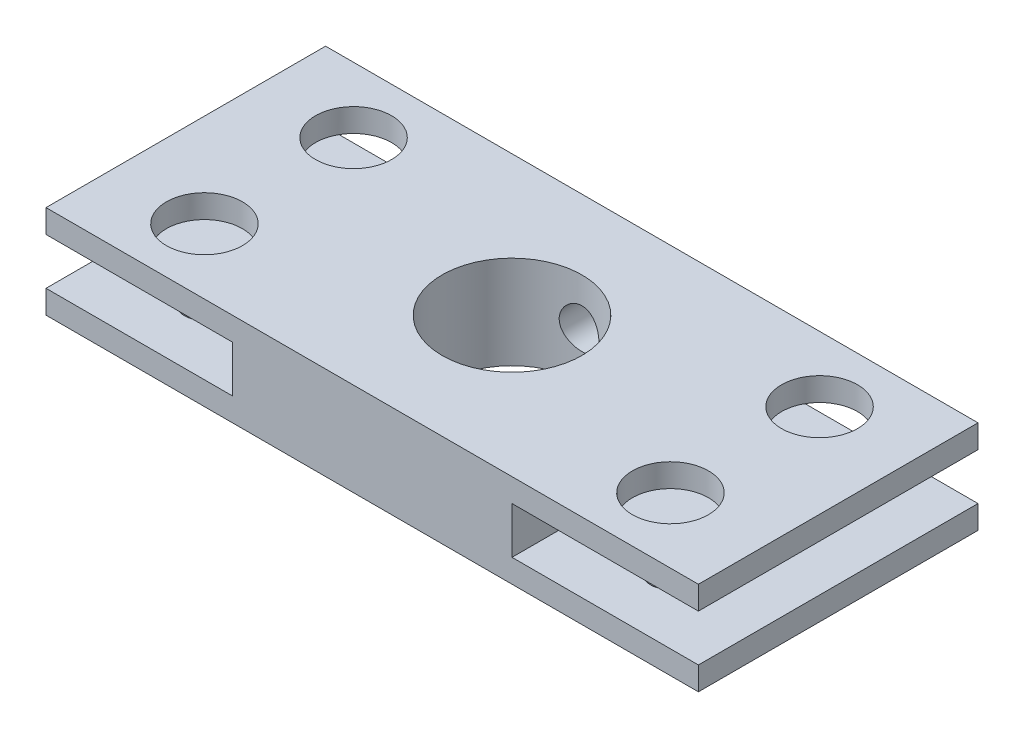
ISO-10303-21;
HEADER;
FILE_DESCRIPTION(('STEP AP214'),'2;1');
FILE_NAME('part.step','',(''),(''),'','','');
FILE_SCHEMA(('AUTOMOTIVE_DESIGN { 1 0 10303 214 1 1 1 1 }'));
ENDSEC;
DATA;
#1=APPLICATION_CONTEXT('core data for automotive mechanical design processes');
#2=APPLICATION_PROTOCOL_DEFINITION('international standard','automotive_design',2000,#1);
#3=PRODUCT_CONTEXT('',#1,'mechanical');
#4=PRODUCT('Part','Part','',(#3));
#5=PRODUCT_RELATED_PRODUCT_CATEGORY('part','',(#4));
#6=PRODUCT_DEFINITION_FORMATION('','',#4);
#7=PRODUCT_DEFINITION_CONTEXT('part definition',#1,'design');
#8=PRODUCT_DEFINITION('design','',#6,#7);
#9=PRODUCT_DEFINITION_SHAPE('','',#8);
#10=(LENGTH_UNIT() NAMED_UNIT(*) SI_UNIT(.MILLI.,.METRE.));
#11=(NAMED_UNIT(*) PLANE_ANGLE_UNIT() SI_UNIT($,.RADIAN.));
#12=(NAMED_UNIT(*) SI_UNIT($,.STERADIAN.) SOLID_ANGLE_UNIT());
#13=UNCERTAINTY_MEASURE_WITH_UNIT(LENGTH_MEASURE(1.E-05),#10,'distance_accuracy_value','');
#14=(GEOMETRIC_REPRESENTATION_CONTEXT(3) GLOBAL_UNCERTAINTY_ASSIGNED_CONTEXT((#13)) GLOBAL_UNIT_ASSIGNED_CONTEXT((#10,
#11,#12)) REPRESENTATION_CONTEXT('',''));
#15=CARTESIAN_POINT('',(0.,0.,0.));
#16=DIRECTION('',(0.,0.,1.));
#17=DIRECTION('',(1.,0.,0.));
#18=AXIS2_PLACEMENT_3D('',#15,#16,#17);
#19=CARTESIAN_POINT('',(0.,6.35,0.));
#20=DIRECTION('',(0.,-1.,0.));
#21=DIRECTION('',(0.,0.,-1.));
#22=AXIS2_PLACEMENT_3D('',#19,#20,#21);
#23=PLANE('',#22);
#24=CARTESIAN_POINT('',(15.875,6.35,5.08));
#25=DIRECTION('',(0.,1.,0.));
#26=DIRECTION('',(0.,0.,1.));
#27=AXIS2_PLACEMENT_3D('',#24,#25,#26);
#28=CIRCLE('',#27,2.59079999999999);
#29=CARTESIAN_POINT('',(15.875,6.35,7.67079999999999));
#30=VERTEX_POINT('',#29);
#31=EDGE_CURVE('E336',#30,#30,#28,.T.);
#32=ORIENTED_EDGE('',*,*,#31,.F.);
#33=EDGE_LOOP('',(#32));
#34=FACE_BOUND('',#33,.T.);
#35=DIRECTION('',(0.,0.,-1.));
#36=VECTOR('',#35,1.);
#37=CARTESIAN_POINT('',(22.225,6.35,9.525));
#38=LINE('',#37,#36);
#39=CARTESIAN_POINT('',(22.225,6.35,9.525));
#40=VERTEX_POINT('',#39);
#41=CARTESIAN_POINT('',(22.225,6.35,-9.525));
#42=VERTEX_POINT('',#41);
#43=EDGE_CURVE('E169',#40,#42,#38,.T.);
#44=ORIENTED_EDGE('',*,*,#43,.T.);
#45=DIRECTION('',(-1.,0.,0.));
#46=VECTOR('',#45,1.);
#47=CARTESIAN_POINT('',(-22.225,6.35,-9.525));
#48=LINE('',#47,#46);
#49=CARTESIAN_POINT('',(-22.225,6.35,-9.525));
#50=VERTEX_POINT('',#49);
#51=EDGE_CURVE('E181',#42,#50,#48,.T.);
#52=ORIENTED_EDGE('',*,*,#51,.T.);
#53=DIRECTION('',(0.,0.,1.));
#54=VECTOR('',#53,1.);
#55=CARTESIAN_POINT('',(-22.225,6.35,9.525));
#56=LINE('',#55,#54);
#57=CARTESIAN_POINT('',(-22.225,6.35,9.525));
#58=VERTEX_POINT('',#57);
#59=EDGE_CURVE('E179',#50,#58,#56,.T.);
#60=ORIENTED_EDGE('',*,*,#59,.T.);
#61=DIRECTION('',(1.,0.,0.));
#62=VECTOR('',#61,1.);
#63=CARTESIAN_POINT('',(-22.225,6.35,9.525));
#64=LINE('',#63,#62);
#65=EDGE_CURVE('E177',#58,#40,#64,.T.);
#66=ORIENTED_EDGE('',*,*,#65,.T.);
#67=EDGE_LOOP('',(#44,#52,#60,#66));
#68=FACE_BOUND('',#67,.T.);
#69=CARTESIAN_POINT('',(0.,6.35,0.));
#70=DIRECTION('',(0.,1.,0.));
#71=DIRECTION('',(0.,0.,1.));
#72=AXIS2_PLACEMENT_3D('',#69,#70,#71);
#73=CIRCLE('',#72,4.7625);
#74=CARTESIAN_POINT('',(0.,6.35,4.7625));
#75=VERTEX_POINT('',#74);
#76=EDGE_CURVE('E176',#75,#75,#73,.T.);
#77=ORIENTED_EDGE('',*,*,#76,.F.);
#78=EDGE_LOOP('',(#77));
#79=FACE_BOUND('',#78,.T.);
#80=CARTESIAN_POINT('',(15.875,6.35,-5.08));
#81=DIRECTION('',(0.,1.,0.));
#82=DIRECTION('',(0.,0.,1.));
#83=AXIS2_PLACEMENT_3D('',#80,#81,#82);
#84=CIRCLE('',#83,2.59079999999999);
#85=CARTESIAN_POINT('',(15.875,6.35,-2.48920000000001));
#86=VERTEX_POINT('',#85);
#87=EDGE_CURVE('E330',#86,#86,#84,.T.);
#88=ORIENTED_EDGE('',*,*,#87,.F.);
#89=EDGE_LOOP('',(#88));
#90=FACE_BOUND('',#89,.T.);
#91=CARTESIAN_POINT('',(-15.875,6.35,5.08));
#92=DIRECTION('',(0.,1.,0.));
#93=DIRECTION('',(0.,0.,1.));
#94=AXIS2_PLACEMENT_3D('',#91,#92,#93);
#95=CIRCLE('',#94,2.59079999999999);
#96=CARTESIAN_POINT('',(-15.875,6.35,7.67079999999999));
#97=VERTEX_POINT('',#96);
#98=EDGE_CURVE('E394',#97,#97,#95,.T.);
#99=ORIENTED_EDGE('',*,*,#98,.F.);
#100=EDGE_LOOP('',(#99));
#101=FACE_BOUND('',#100,.T.);
#102=CARTESIAN_POINT('',(-15.875,6.35,-5.08));
#103=DIRECTION('',(0.,1.,0.));
#104=DIRECTION('',(0.,0.,1.));
#105=AXIS2_PLACEMENT_3D('',#102,#103,#104);
#106=CIRCLE('',#105,2.59079999999999);
#107=CARTESIAN_POINT('',(-15.875,6.35,-2.48920000000001));
#108=VERTEX_POINT('',#107);
#109=EDGE_CURVE('E397',#108,#108,#106,.T.);
#110=ORIENTED_EDGE('',*,*,#109,.F.);
#111=EDGE_LOOP('',(#110));
#112=FACE_BOUND('',#111,.T.);
#113=ADVANCED_FACE('F43',(#34,#68,#79,#90,#101,#112),#23,.F.);
#114=CARTESIAN_POINT('',(-22.225,6.35,-9.525));
#115=DIRECTION('',(0.,0.,1.));
#116=DIRECTION('',(1.,0.,0.));
#117=AXIS2_PLACEMENT_3D('',#114,#115,#116);
#118=PLANE('',#117);
#119=CARTESIAN_POINT('',(0.,3.175,-9.525));
#120=DIRECTION('',(0.,0.,-1.));
#121=DIRECTION('',(-1.,0.,0.));
#122=AXIS2_PLACEMENT_3D('',#119,#120,#121);
#123=CIRCLE('',#122,1.35255);
#124=CARTESIAN_POINT('',(-1.35255,3.175,-9.525));
#125=VERTEX_POINT('',#124);
#126=EDGE_CURVE('E198',#125,#125,#123,.T.);
#127=ORIENTED_EDGE('',*,*,#126,.F.);
#128=EDGE_LOOP('',(#127));
#129=FACE_BOUND('',#128,.T.);
#130=DIRECTION('',(1.,0.,0.));
#131=VECTOR('',#130,1.);
#132=CARTESIAN_POINT('',(-9.52500000000001,4.7625,-9.525));
#133=LINE('',#132,#131);
#134=CARTESIAN_POINT('',(-22.225,4.7625,-9.525));
#135=VERTEX_POINT('',#134);
#136=CARTESIAN_POINT('',(-9.52500000000001,4.7625,-9.525));
#137=VERTEX_POINT('',#136);
#138=EDGE_CURVE('E149',#135,#137,#133,.T.);
#139=ORIENTED_EDGE('',*,*,#138,.F.);
#140=DIRECTION('',(0.,-1.,0.));
#141=VECTOR('',#140,1.);
#142=CARTESIAN_POINT('',(-22.225,6.35,-9.525));
#143=LINE('',#142,#141);
#144=EDGE_CURVE('E156',#50,#135,#143,.T.);
#145=ORIENTED_EDGE('',*,*,#144,.F.);
#146=ORIENTED_EDGE('',*,*,#51,.F.);
#147=DIRECTION('',(0.,-1.,0.));
#148=VECTOR('',#147,1.);
#149=CARTESIAN_POINT('',(22.225,6.35,-9.525));
#150=LINE('',#149,#148);
#151=CARTESIAN_POINT('',(22.225,4.7625,-9.525));
#152=VERTEX_POINT('',#151);
#153=EDGE_CURVE('E11',#42,#152,#150,.T.);
#154=ORIENTED_EDGE('',*,*,#153,.T.);
#155=DIRECTION('',(-1.,0.,0.));
#156=VECTOR('',#155,1.);
#157=CARTESIAN_POINT('',(9.52500000000001,4.7625,-9.525));
#158=LINE('',#157,#156);
#159=CARTESIAN_POINT('',(9.52500000000001,4.7625,-9.525));
#160=VERTEX_POINT('',#159);
#161=EDGE_CURVE('E343',#152,#160,#158,.T.);
#162=ORIENTED_EDGE('',*,*,#161,.T.);
#163=DIRECTION('',(0.,-1.,0.));
#164=VECTOR('',#163,1.);
#165=CARTESIAN_POINT('',(9.52500000000001,1.5875,-9.525));
#166=LINE('',#165,#164);
#167=CARTESIAN_POINT('',(9.52500000000001,1.5875,-9.525));
#168=VERTEX_POINT('',#167);
#169=EDGE_CURVE('E346',#160,#168,#166,.T.);
#170=ORIENTED_EDGE('',*,*,#169,.T.);
#171=DIRECTION('',(1.,0.,0.));
#172=VECTOR('',#171,1.);
#173=CARTESIAN_POINT('',(9.52500000000001,1.5875,-9.525));
#174=LINE('',#173,#172);
#175=CARTESIAN_POINT('',(22.225,1.5875,-9.525));
#176=VERTEX_POINT('',#175);
#177=EDGE_CURVE('E350',#168,#176,#174,.T.);
#178=ORIENTED_EDGE('',*,*,#177,.T.);
#179=CARTESIAN_POINT('',(22.225,0.,-9.525));
#180=VERTEX_POINT('',#179);
#181=EDGE_CURVE('E51',#176,#180,#150,.T.);
#182=ORIENTED_EDGE('',*,*,#181,.T.);
#183=DIRECTION('',(-1.,0.,0.));
#184=VECTOR('',#183,1.);
#185=CARTESIAN_POINT('',(-22.225,0.,-9.525));
#186=LINE('',#185,#184);
#187=CARTESIAN_POINT('',(-22.225,0.,-9.525));
#188=VERTEX_POINT('',#187);
#189=EDGE_CURVE('E154',#180,#188,#186,.T.);
#190=ORIENTED_EDGE('',*,*,#189,.T.);
#191=CARTESIAN_POINT('',(-22.225,1.5875,-9.525));
#192=VERTEX_POINT('',#191);
#193=EDGE_CURVE('E146',#192,#188,#143,.T.);
#194=ORIENTED_EDGE('',*,*,#193,.F.);
#195=DIRECTION('',(-1.,0.,0.));
#196=VECTOR('',#195,1.);
#197=CARTESIAN_POINT('',(-9.52500000000001,1.5875,-9.525));
#198=LINE('',#197,#196);
#199=CARTESIAN_POINT('',(-9.52500000000001,1.5875,-9.525));
#200=VERTEX_POINT('',#199);
#201=EDGE_CURVE('E133',#200,#192,#198,.T.);
#202=ORIENTED_EDGE('',*,*,#201,.F.);
#203=DIRECTION('',(0.,-1.,0.));
#204=VECTOR('',#203,1.);
#205=CARTESIAN_POINT('',(-9.52500000000001,1.5875,-9.525));
#206=LINE('',#205,#204);
#207=EDGE_CURVE('E139',#137,#200,#206,.T.);
#208=ORIENTED_EDGE('',*,*,#207,.F.);
#209=EDGE_LOOP('',(#139,#145,#146,#154,#162,#170,#178,#182,#190,#194,#202,#208));
#210=FACE_BOUND('',#209,.T.);
#211=ADVANCED_FACE('F152',(#129,#210),#118,.F.);
#212=CARTESIAN_POINT('',(-22.225,6.35,9.525));
#213=DIRECTION('',(1.,0.,0.));
#214=DIRECTION('',(0.,0.,-1.));
#215=AXIS2_PLACEMENT_3D('',#212,#213,#214);
#216=PLANE('',#215);
#217=DIRECTION('',(0.,0.,1.));
#218=VECTOR('',#217,1.);
#219=CARTESIAN_POINT('',(-22.225,4.7625,-9.525));
#220=LINE('',#219,#218);
#221=CARTESIAN_POINT('',(-22.225,4.7625,9.525));
#222=VERTEX_POINT('',#221);
#223=EDGE_CURVE('E293',#135,#222,#220,.T.);
#224=ORIENTED_EDGE('',*,*,#223,.T.);
#225=DIRECTION('',(0.,-1.,0.));
#226=VECTOR('',#225,1.);
#227=CARTESIAN_POINT('',(-22.225,6.35,9.525));
#228=LINE('',#227,#226);
#229=EDGE_CURVE('E157',#58,#222,#228,.T.);
#230=ORIENTED_EDGE('',*,*,#229,.F.);
#231=ORIENTED_EDGE('',*,*,#59,.F.);
#232=ORIENTED_EDGE('',*,*,#144,.T.);
#233=EDGE_LOOP('',(#224,#230,#231,#232));
#234=FACE_BOUND('',#233,.T.);
#235=ADVANCED_FACE('F274',(#234),#216,.F.);
#236=DIRECTION('',(0.,0.,1.));
#237=VECTOR('',#236,1.);
#238=CARTESIAN_POINT('',(-22.225,1.5875,-9.525));
#239=LINE('',#238,#237);
#240=CARTESIAN_POINT('',(-22.225,1.5875,9.525));
#241=VERTEX_POINT('',#240);
#242=EDGE_CURVE('E58',#192,#241,#239,.T.);
#243=ORIENTED_EDGE('',*,*,#242,.F.);
#244=ORIENTED_EDGE('',*,*,#193,.T.);
#245=DIRECTION('',(0.,0.,1.));
#246=VECTOR('',#245,1.);
#247=CARTESIAN_POINT('',(-22.225,0.,9.525));
#248=LINE('',#247,#246);
#249=CARTESIAN_POINT('',(-22.225,0.,9.525));
#250=VERTEX_POINT('',#249);
#251=EDGE_CURVE('E170',#188,#250,#248,.T.);
#252=ORIENTED_EDGE('',*,*,#251,.T.);
#253=EDGE_CURVE('E148',#241,#250,#228,.T.);
#254=ORIENTED_EDGE('',*,*,#253,.F.);
#255=EDGE_LOOP('',(#243,#244,#252,#254));
#256=FACE_BOUND('',#255,.T.);
#257=ADVANCED_FACE('F144',(#256),#216,.F.);
#258=CARTESIAN_POINT('',(-22.225,6.35,9.525));
#259=DIRECTION('',(0.,0.,-1.));
#260=DIRECTION('',(-1.,0.,0.));
#261=AXIS2_PLACEMENT_3D('',#258,#259,#260);
#262=PLANE('',#261);
#263=DIRECTION('',(1.,0.,0.));
#264=VECTOR('',#263,1.);
#265=CARTESIAN_POINT('',(-9.52500000000001,4.7625,9.525));
#266=LINE('',#265,#264);
#267=CARTESIAN_POINT('',(-9.52500000000001,4.7625,9.525));
#268=VERTEX_POINT('',#267);
#269=EDGE_CURVE('E140',#222,#268,#266,.T.);
#270=ORIENTED_EDGE('',*,*,#269,.T.);
#271=DIRECTION('',(0.,-1.,0.));
#272=VECTOR('',#271,1.);
#273=CARTESIAN_POINT('',(-9.52500000000001,1.5875,9.525));
#274=LINE('',#273,#272);
#275=CARTESIAN_POINT('',(-9.52500000000001,1.5875,9.525));
#276=VERTEX_POINT('',#275);
#277=EDGE_CURVE('E313',#268,#276,#274,.T.);
#278=ORIENTED_EDGE('',*,*,#277,.T.);
#279=DIRECTION('',(-1.,0.,0.));
#280=VECTOR('',#279,1.);
#281=CARTESIAN_POINT('',(-9.52500000000001,1.5875,9.525));
#282=LINE('',#281,#280);
#283=EDGE_CURVE('E311',#276,#241,#282,.T.);
#284=ORIENTED_EDGE('',*,*,#283,.T.);
#285=ORIENTED_EDGE('',*,*,#253,.T.);
#286=DIRECTION('',(1.,0.,0.));
#287=VECTOR('',#286,1.);
#288=CARTESIAN_POINT('',(-22.225,0.,9.525));
#289=LINE('',#288,#287);
#290=CARTESIAN_POINT('',(22.225,0.,9.525));
#291=VERTEX_POINT('',#290);
#292=EDGE_CURVE('E166',#250,#291,#289,.T.);
#293=ORIENTED_EDGE('',*,*,#292,.T.);
#294=DIRECTION('',(0.,-1.,0.));
#295=VECTOR('',#294,1.);
#296=CARTESIAN_POINT('',(22.225,6.35,9.525));
#297=LINE('',#296,#295);
#298=CARTESIAN_POINT('',(22.225,1.5875,9.525));
#299=VERTEX_POINT('',#298);
#300=EDGE_CURVE('E165',#299,#291,#297,.T.);
#301=ORIENTED_EDGE('',*,*,#300,.F.);
#302=DIRECTION('',(1.,0.,0.));
#303=VECTOR('',#302,1.);
#304=CARTESIAN_POINT('',(9.52500000000001,1.5875,9.525));
#305=LINE('',#304,#303);
#306=CARTESIAN_POINT('',(9.52500000000001,1.5875,9.525));
#307=VERTEX_POINT('',#306);
#308=EDGE_CURVE('E347',#307,#299,#305,.T.);
#309=ORIENTED_EDGE('',*,*,#308,.F.);
#310=DIRECTION('',(0.,-1.,0.));
#311=VECTOR('',#310,1.);
#312=CARTESIAN_POINT('',(9.52500000000001,1.5875,9.525));
#313=LINE('',#312,#311);
#314=CARTESIAN_POINT('',(9.52500000000001,4.7625,9.525));
#315=VERTEX_POINT('',#314);
#316=EDGE_CURVE('E354',#315,#307,#313,.T.);
#317=ORIENTED_EDGE('',*,*,#316,.F.);
#318=DIRECTION('',(-1.,0.,0.));
#319=VECTOR('',#318,1.);
#320=CARTESIAN_POINT('',(9.52500000000001,4.7625,9.525));
#321=LINE('',#320,#319);
#322=CARTESIAN_POINT('',(22.225,4.7625,9.525));
#323=VERTEX_POINT('',#322);
#324=EDGE_CURVE('E342',#323,#315,#321,.T.);
#325=ORIENTED_EDGE('',*,*,#324,.F.);
#326=EDGE_CURVE('E162',#40,#323,#297,.T.);
#327=ORIENTED_EDGE('',*,*,#326,.F.);
#328=ORIENTED_EDGE('',*,*,#65,.F.);
#329=ORIENTED_EDGE('',*,*,#229,.T.);
#330=EDGE_LOOP('',(#270,#278,#284,#285,#293,#301,#309,#317,#325,#327,#328,#329));
#331=FACE_BOUND('',#330,.T.);
#332=ADVANCED_FACE('F221',(#331),#262,.F.);
#333=CARTESIAN_POINT('',(9.52500000000001,1.5875,-9.525));
#334=DIRECTION('',(0.,-1.,0.));
#335=DIRECTION('',(0.,0.,-1.));
#336=AXIS2_PLACEMENT_3D('',#333,#334,#335);
#337=PLANE('',#336);
#338=ORIENTED_EDGE('',*,*,#308,.T.);
#339=DIRECTION('',(0.,0.,1.));
#340=VECTOR('',#339,1.);
#341=CARTESIAN_POINT('',(22.225,1.5875,-9.525));
#342=LINE('',#341,#340);
#343=EDGE_CURVE('E358',#176,#299,#342,.T.);
#344=ORIENTED_EDGE('',*,*,#343,.F.);
#345=ORIENTED_EDGE('',*,*,#177,.F.);
#346=DIRECTION('',(0.,0.,1.));
#347=VECTOR('',#346,1.);
#348=CARTESIAN_POINT('',(9.52500000000001,1.5875,-9.525));
#349=LINE('',#348,#347);
#350=EDGE_CURVE('E361',#168,#307,#349,.T.);
#351=ORIENTED_EDGE('',*,*,#350,.T.);
#352=EDGE_LOOP('',(#338,#344,#345,#351));
#353=FACE_BOUND('',#352,.T.);
#354=CARTESIAN_POINT('',(15.875,1.5875,5.08));
#355=DIRECTION('',(0.,1.,0.));
#356=DIRECTION('',(0.,0.,1.));
#357=AXIS2_PLACEMENT_3D('',#354,#355,#356);
#358=CIRCLE('',#357,1.35255);
#359=CARTESIAN_POINT('',(15.875,1.5875,6.43255));
#360=VERTEX_POINT('',#359);
#361=EDGE_CURVE('E324',#360,#360,#358,.T.);
#362=ORIENTED_EDGE('',*,*,#361,.F.);
#363=EDGE_LOOP('',(#362));
#364=FACE_BOUND('',#363,.T.);
#365=CARTESIAN_POINT('',(15.875,1.5875,-5.08));
#366=DIRECTION('',(0.,1.,0.));
#367=DIRECTION('',(0.,0.,1.));
#368=AXIS2_PLACEMENT_3D('',#365,#366,#367);
#369=CIRCLE('',#368,1.35255);
#370=CARTESIAN_POINT('',(15.875,1.5875,-3.72745));
#371=VERTEX_POINT('',#370);
#372=EDGE_CURVE('E298',#371,#371,#369,.T.);
#373=ORIENTED_EDGE('',*,*,#372,.F.);
#374=EDGE_LOOP('',(#373));
#375=FACE_BOUND('',#374,.T.);
#376=ADVANCED_FACE('F217',(#353,#364,#375),#337,.F.);
#377=CARTESIAN_POINT('',(22.225,6.35,9.525));
#378=DIRECTION('',(-1.,0.,0.));
#379=DIRECTION('',(0.,0.,1.));
#380=AXIS2_PLACEMENT_3D('',#377,#378,#379);
#381=PLANE('',#380);
#382=ORIENTED_EDGE('',*,*,#181,.F.);
#383=ORIENTED_EDGE('',*,*,#343,.T.);
#384=ORIENTED_EDGE('',*,*,#300,.T.);
#385=DIRECTION('',(0.,0.,-1.));
#386=VECTOR('',#385,1.);
#387=CARTESIAN_POINT('',(22.225,0.,9.525));
#388=LINE('',#387,#386);
#389=EDGE_CURVE('E173',#291,#180,#388,.T.);
#390=ORIENTED_EDGE('',*,*,#389,.T.);
#391=EDGE_LOOP('',(#382,#383,#384,#390));
#392=FACE_BOUND('',#391,.T.);
#393=ADVANCED_FACE('F220',(#392),#381,.F.);
#394=CARTESIAN_POINT('',(0.,0.,0.));
#395=DIRECTION('',(0.,-1.,0.));
#396=DIRECTION('',(0.,0.,-1.));
#397=AXIS2_PLACEMENT_3D('',#394,#395,#396);
#398=PLANE('',#397);
#399=CARTESIAN_POINT('',(-15.875,0.,-5.08));
#400=DIRECTION('',(0.,-1.,0.));
#401=DIRECTION('',(0.,0.,-1.));
#402=AXIS2_PLACEMENT_3D('',#399,#400,#401);
#403=CIRCLE('',#402,1.35255);
#404=CARTESIAN_POINT('',(-15.875,0.,-6.43255));
#405=VERTEX_POINT('',#404);
#406=EDGE_CURVE('E415',#405,#405,#403,.T.);
#407=ORIENTED_EDGE('',*,*,#406,.F.);
#408=EDGE_LOOP('',(#407));
#409=FACE_BOUND('',#408,.T.);
#410=CARTESIAN_POINT('',(-15.875,0.,5.08));
#411=DIRECTION('',(0.,-1.,0.));
#412=DIRECTION('',(0.,0.,-1.));
#413=AXIS2_PLACEMENT_3D('',#410,#411,#412);
#414=CIRCLE('',#413,1.35255);
#415=CARTESIAN_POINT('',(-15.875,0.,3.72745));
#416=VERTEX_POINT('',#415);
#417=EDGE_CURVE('E399',#416,#416,#414,.T.);
#418=ORIENTED_EDGE('',*,*,#417,.F.);
#419=EDGE_LOOP('',(#418));
#420=FACE_BOUND('',#419,.T.);
#421=CARTESIAN_POINT('',(15.875,0.,-5.08));
#422=DIRECTION('',(0.,-1.,0.));
#423=DIRECTION('',(0.,0.,-1.));
#424=AXIS2_PLACEMENT_3D('',#421,#422,#423);
#425=CIRCLE('',#424,1.35255);
#426=CARTESIAN_POINT('',(15.875,0.,-6.43255));
#427=VERTEX_POINT('',#426);
#428=EDGE_CURVE('E321',#427,#427,#425,.T.);
#429=ORIENTED_EDGE('',*,*,#428,.F.);
#430=EDGE_LOOP('',(#429));
#431=FACE_BOUND('',#430,.T.);
#432=CARTESIAN_POINT('',(15.875,0.,5.08));
#433=DIRECTION('',(0.,-1.,0.));
#434=DIRECTION('',(0.,0.,-1.));
#435=AXIS2_PLACEMENT_3D('',#432,#433,#434);
#436=CIRCLE('',#435,1.35255);
#437=CARTESIAN_POINT('',(15.875,0.,3.72745));
#438=VERTEX_POINT('',#437);
#439=EDGE_CURVE('E327',#438,#438,#436,.T.);
#440=ORIENTED_EDGE('',*,*,#439,.F.);
#441=EDGE_LOOP('',(#440));
#442=FACE_BOUND('',#441,.T.);
#443=ORIENTED_EDGE('',*,*,#389,.F.);
#444=ORIENTED_EDGE('',*,*,#292,.F.);
#445=ORIENTED_EDGE('',*,*,#251,.F.);
#446=ORIENTED_EDGE('',*,*,#189,.F.);
#447=EDGE_LOOP('',(#443,#444,#445,#446));
#448=FACE_BOUND('',#447,.T.);
#449=CARTESIAN_POINT('',(0.,0.,0.));
#450=DIRECTION('',(0.,1.,0.));
#451=DIRECTION('',(0.,0.,1.));
#452=AXIS2_PLACEMENT_3D('',#449,#450,#451);
#453=CIRCLE('',#452,4.7625);
#454=CARTESIAN_POINT('',(0.,0.,4.7625));
#455=VERTEX_POINT('',#454);
#456=EDGE_CURVE('E185',#455,#455,#453,.T.);
#457=ORIENTED_EDGE('',*,*,#456,.T.);
#458=EDGE_LOOP('',(#457));
#459=FACE_BOUND('',#458,.T.);
#460=ADVANCED_FACE('F279',(#409,#420,#431,#442,#448,#459),#398,.T.);
#461=ORIENTED_EDGE('',*,*,#326,.T.);
#462=DIRECTION('',(0.,0.,1.));
#463=VECTOR('',#462,1.);
#464=CARTESIAN_POINT('',(22.225,4.7625,-9.525));
#465=LINE('',#464,#463);
#466=EDGE_CURVE('E66',#152,#323,#465,.T.);
#467=ORIENTED_EDGE('',*,*,#466,.F.);
#468=ORIENTED_EDGE('',*,*,#153,.F.);
#469=ORIENTED_EDGE('',*,*,#43,.F.);
#470=EDGE_LOOP('',(#461,#467,#468,#469));
#471=FACE_BOUND('',#470,.T.);
#472=ADVANCED_FACE('F45',(#471),#381,.F.);
#473=CARTESIAN_POINT('',(0.,6.35,0.));
#474=DIRECTION('',(0.,-1.,0.));
#475=DIRECTION('',(0.,0.,-1.));
#476=AXIS2_PLACEMENT_3D('',#473,#474,#475);
#477=CYLINDRICAL_SURFACE('',#476,4.7625);
#478=CARTESIAN_POINT('',(0.,4.52755,-4.7625));
#479=CARTESIAN_POINT('',(-0.0743784999581474,4.5275486430201,-4.7624990905622));
#480=CARTESIAN_POINT('',(-0.148770997363666,4.52139427786597,-4.76074068414839));
#481=CARTESIAN_POINT('',(-0.29540104844341,4.49699047829311,-4.75389731213497));
#482=CARTESIAN_POINT('',(-0.367637754898103,4.47873635244937,-4.74881105624237));
#483=CARTESIAN_POINT('',(-0.507819372462201,4.43078329715905,-4.73587132206403));
#484=CARTESIAN_POINT('',(-0.575770075173447,4.40110021454008,-4.72802167664354));
#485=CARTESIAN_POINT('',(-0.705729564095678,4.33119378181307,-4.710377746781));
#486=CARTESIAN_POINT('',(-0.767737748085329,4.29096936497405,-4.70058326555549));
#487=CARTESIAN_POINT('',(-0.885664511249006,4.20001870977713,-4.67981587709255));
#488=CARTESIAN_POINT('',(-0.941406614739935,4.14906872941423,-4.66882075569231));
#489=CARTESIAN_POINT('',(-1.04368118906315,4.03859076612216,-4.64702871784162));
#490=CARTESIAN_POINT('',(-1.09021229789723,3.97906151685142,-4.63623183091725));
#491=CARTESIAN_POINT('',(-1.17363874376928,3.85166351744424,-4.61582763733191));
#492=CARTESIAN_POINT('',(-1.21032481599622,3.78365286087309,-4.60624815020734));
#493=CARTESIAN_POINT('',(-1.27166948775742,3.64211211694877,-4.58969276319239));
#494=CARTESIAN_POINT('',(-1.29633063999,3.56858320486075,-4.58271631079326));
#495=CARTESIAN_POINT('',(-1.3323006220351,3.42006189795207,-4.57238733366614));
#496=CARTESIAN_POINT('',(-1.34393220362154,3.34515390446938,-4.56894739365361));
#497=CARTESIAN_POINT('',(-1.35451996418055,3.1943768560357,-4.56582030437458));
#498=CARTESIAN_POINT('',(-1.35347886096572,3.11850801063768,-4.5661323504485));
#499=CARTESIAN_POINT('',(-1.33900564806272,2.97053442802031,-4.57039612187765));
#500=CARTESIAN_POINT('',(-1.32597092922697,2.89838691263082,-4.57423111302579));
#501=CARTESIAN_POINT('',(-1.28851978726118,2.75734778962324,-4.58492077482652));
#502=CARTESIAN_POINT('',(-1.26410234621991,2.688456473801,-4.59177571553807));
#503=CARTESIAN_POINT('',(-1.20427101589375,2.55488196332034,-4.60783068706061));
#504=CARTESIAN_POINT('',(-1.16872313756866,2.49026233362383,-4.61705903338387));
#505=CARTESIAN_POINT('',(-1.08773328002495,2.36776901838411,-4.63680661480737));
#506=CARTESIAN_POINT('',(-1.04228912138712,2.30989682311937,-4.64732613403455));
#507=CARTESIAN_POINT('',(-0.940794256967904,2.20027881637208,-4.66895040089115));
#508=CARTESIAN_POINT('',(-0.884411776618571,2.14884113440109,-4.68006235899327));
#509=CARTESIAN_POINT('',(-0.763683506834272,2.056083587976,-4.701270538666));
#510=CARTESIAN_POINT('',(-0.699337314715698,2.01476423546827,-4.71136670882664));
#511=CARTESIAN_POINT('',(-0.563989221375801,1.94325494809201,-4.72948235962791));
#512=CARTESIAN_POINT('',(-0.492952838256662,1.91312712835502,-4.73749017851947));
#513=CARTESIAN_POINT('',(-0.34654257532488,1.86533374841148,-4.75044281323286));
#514=CARTESIAN_POINT('',(-0.271169780302289,1.8476650859767,-4.75538839149013));
#515=CARTESIAN_POINT('',(-0.120850696904539,1.8257900941737,-4.76154131476189));
#516=CARTESIAN_POINT('',(-0.0459699308038016,1.82116553193465,-4.76286475366233));
#517=CARTESIAN_POINT('',(0.10349956640034,1.82434628148552,-4.76196150939729));
#518=CARTESIAN_POINT('',(0.178088331040754,1.8321501211997,-4.75973524667437));
#519=CARTESIAN_POINT('',(0.323320333171315,1.85962538244712,-4.75205828854765));
#520=CARTESIAN_POINT('',(0.394012520550826,1.8790578995256,-4.74667254553646));
#521=CARTESIAN_POINT('',(0.531122495891907,1.92895641763358,-4.73329318241284));
#522=CARTESIAN_POINT('',(0.5975397910662,1.95942368801874,-4.72529926228568));
#523=CARTESIAN_POINT('',(0.725796270146898,2.03126494247287,-4.70732543764485));
#524=CARTESIAN_POINT('',(0.787506578464485,2.07285900781803,-4.6973065860586));
#525=CARTESIAN_POINT('',(0.903216277264466,2.16550128896996,-4.67643766201817));
#526=CARTESIAN_POINT('',(0.957213930011424,2.21655162943405,-4.66558740308336));
#527=CARTESIAN_POINT('',(1.0577689096824,2.32861713337727,-4.64384180185687));
#528=CARTESIAN_POINT('',(1.10402970104661,2.38990082578654,-4.6329563160084));
#529=CARTESIAN_POINT('',(1.18562443626754,2.51959581025901,-4.61275127903121));
#530=CARTESIAN_POINT('',(1.22095876925181,2.58800684837768,-4.60343167214173));
#531=CARTESIAN_POINT('',(1.27943864976602,2.72972431512764,-4.58752245180626));
#532=CARTESIAN_POINT('',(1.3026495237019,2.80300205720859,-4.58091824850396));
#533=CARTESIAN_POINT('',(1.33634832071343,2.95264418491539,-4.5712025660945));
#534=CARTESIAN_POINT('',(1.34684004147844,3.02900764216698,-4.5680900444605));
#535=CARTESIAN_POINT('',(1.35456349369031,3.17959566461426,-4.56580529583762));
#536=CARTESIAN_POINT('',(1.35227511990277,3.25379379693445,-4.56649045772405));
#537=CARTESIAN_POINT('',(1.33563291667447,3.40069987613526,-4.57138541209335));
#538=CARTESIAN_POINT('',(1.32127948086557,3.47340787155346,-4.57559508958619));
#539=CARTESIAN_POINT('',(1.28120938194407,3.61457466494029,-4.58697424833289));
#540=CARTESIAN_POINT('',(1.25560725829135,3.68306855721659,-4.5941138485776));
#541=CARTESIAN_POINT('',(1.19385511761934,3.81484262392982,-4.61054579052911));
#542=CARTESIAN_POINT('',(1.15770325253401,3.87812188239307,-4.61983850935274));
#543=CARTESIAN_POINT('',(1.07447772612258,3.9999291052839,-4.63991281967711));
#544=CARTESIAN_POINT('',(1.02708281091476,4.05823115248444,-4.65073344512606));
#545=CARTESIAN_POINT('',(0.92331087367047,4.1662102271965,-4.67244141501305));
#546=CARTESIAN_POINT('',(0.866931600829681,4.21588508684919,-4.68332877551092));
#547=CARTESIAN_POINT('',(0.745075103274015,4.30644175885675,-4.70427270151549));
#548=CARTESIAN_POINT('',(0.679404116686308,4.34706990505124,-4.71430135163212));
#549=CARTESIAN_POINT('',(0.541879248534658,4.41664775838159,-4.73207848194561));
#550=CARTESIAN_POINT('',(0.470028828292718,4.44560395236433,-4.73982822802492));
#551=CARTESIAN_POINT('',(0.332182453383481,4.48782989682263,-4.751335030315));
#552=CARTESIAN_POINT('',(0.266702044494606,4.50268750874605,-4.75548935771175));
#553=CARTESIAN_POINT('',(0.134151413500936,4.52254753056349,-4.76107207516973));
#554=CARTESIAN_POINT('',(0.0670813995808871,4.52755122384977,-4.76250082021498));
#555=CARTESIAN_POINT('',(0.,4.52755,-4.7625));
#556=B_SPLINE_CURVE_WITH_KNOTS('',3,(#478,#479,#480,#481,#482,#483,#484,#485,#486,#487,#488,
#489,#490,#491,#492,#493,#494,#495,#496,#497,#498,#499,#500,#501,#502,#503,#504,#505,#506,#507,
#508,#509,#510,#511,#512,#513,#514,#515,#516,#517,#518,#519,#520,#521,#522,#523,#524,#525,#526,
#527,#528,#529,#530,#531,#532,#533,#534,#535,#536,#537,#538,#539,#540,#541,#542,#543,#544,#545,
#546,#547,#548,#549,#550,#551,#552,#553,#554,#555),.UNSPECIFIED.,.T.,.F.,(4,2,2,2,2,2,2,2,2,2,2,
2,2,2,2,2,2,2,2,2,2,2,2,2,2,2,2,2,2,2,2,2,2,2,2,2,2,2,4),(0.,0.222889294304383,
0.445865059785244,0.668532764991209,0.891223011776168,1.11912484754546,1.34706035724664,
1.5795136457763,1.81191756668119,2.03842777803386,2.26488941235131,2.48410768184066,
2.70334555890311,2.92533126990746,3.14736591748721,3.3776632797834,3.60797229178431,
3.83954111207457,4.07105225324437,4.29505113405518,4.51902348540568,4.73854523915272,
4.95809225306819,5.18235198880407,5.40666217297808,5.63821506829868,5.86975971630009,
6.10004348477565,6.33025847809252,6.55188840440896,6.77351110016065,6.99292761660176,
7.21238259274194,7.43908482813347,7.66584394760145,7.89832815072563,8.13068296884128,
8.33173130329812,8.53275345112239),.UNSPECIFIED.);
#557=CARTESIAN_POINT('',(0.,4.52755,-4.7625));
#558=VERTEX_POINT('',#557);
#559=EDGE_CURVE('E188',#558,#558,#556,.T.);
#560=ORIENTED_EDGE('',*,*,#559,.F.);
#561=EDGE_LOOP('',(#560));
#562=FACE_BOUND('',#561,.T.);
#563=ORIENTED_EDGE('',*,*,#76,.T.);
#564=EDGE_LOOP('',(#563));
#565=FACE_BOUND('',#564,.T.);
#566=ORIENTED_EDGE('',*,*,#456,.F.);
#567=EDGE_LOOP('',(#566));
#568=FACE_BOUND('',#567,.T.);
#569=ADVANCED_FACE('F207',(#562,#565,#568),#477,.F.);
#570=CARTESIAN_POINT('',(0.,3.175,-9.525));
#571=DIRECTION('',(0.,0.,-1.));
#572=DIRECTION('',(-1.,0.,0.));
#573=AXIS2_PLACEMENT_3D('',#570,#571,#572);
#574=CYLINDRICAL_SURFACE('',#573,1.35255);
#575=ORIENTED_EDGE('',*,*,#126,.T.);
#576=EDGE_LOOP('',(#575));
#577=FACE_BOUND('',#576,.T.);
#578=ORIENTED_EDGE('',*,*,#559,.T.);
#579=EDGE_LOOP('',(#578));
#580=FACE_BOUND('',#579,.T.);
#581=ADVANCED_FACE('F202',(#577,#580),#574,.F.);
#582=CARTESIAN_POINT('',(9.52500000000001,1.5875,-9.525));
#583=DIRECTION('',(-1.,0.,0.));
#584=DIRECTION('',(0.,0.,1.));
#585=AXIS2_PLACEMENT_3D('',#582,#583,#584);
#586=PLANE('',#585);
#587=ORIENTED_EDGE('',*,*,#316,.T.);
#588=ORIENTED_EDGE('',*,*,#350,.F.);
#589=ORIENTED_EDGE('',*,*,#169,.F.);
#590=DIRECTION('',(0.,0.,1.));
#591=VECTOR('',#590,1.);
#592=CARTESIAN_POINT('',(9.52500000000001,4.7625,-9.525));
#593=LINE('',#592,#591);
#594=EDGE_CURVE('E363',#160,#315,#593,.T.);
#595=ORIENTED_EDGE('',*,*,#594,.T.);
#596=EDGE_LOOP('',(#587,#588,#589,#595));
#597=FACE_BOUND('',#596,.T.);
#598=ADVANCED_FACE('F206',(#597),#586,.F.);
#599=CARTESIAN_POINT('',(9.52500000000001,4.7625,-9.525));
#600=DIRECTION('',(0.,1.,0.));
#601=DIRECTION('',(0.,0.,1.));
#602=AXIS2_PLACEMENT_3D('',#599,#600,#601);
#603=PLANE('',#602);
#604=CARTESIAN_POINT('',(15.875,4.7625,-5.08));
#605=DIRECTION('',(0.,1.,0.));
#606=DIRECTION('',(0.,0.,1.));
#607=AXIS2_PLACEMENT_3D('',#604,#605,#606);
#608=CIRCLE('',#607,2.59079999999999);
#609=CARTESIAN_POINT('',(15.875,4.7625,-2.48920000000001));
#610=VERTEX_POINT('',#609);
#611=EDGE_CURVE('E333',#610,#610,#608,.T.);
#612=ORIENTED_EDGE('',*,*,#611,.T.);
#613=EDGE_LOOP('',(#612));
#614=FACE_BOUND('',#613,.T.);
#615=CARTESIAN_POINT('',(15.875,4.7625,5.08));
#616=DIRECTION('',(0.,1.,0.));
#617=DIRECTION('',(0.,0.,1.));
#618=AXIS2_PLACEMENT_3D('',#615,#616,#617);
#619=CIRCLE('',#618,2.59079999999999);
#620=CARTESIAN_POINT('',(15.875,4.7625,7.67079999999999));
#621=VERTEX_POINT('',#620);
#622=EDGE_CURVE('E339',#621,#621,#619,.T.);
#623=ORIENTED_EDGE('',*,*,#622,.T.);
#624=EDGE_LOOP('',(#623));
#625=FACE_BOUND('',#624,.T.);
#626=ORIENTED_EDGE('',*,*,#324,.T.);
#627=ORIENTED_EDGE('',*,*,#594,.F.);
#628=ORIENTED_EDGE('',*,*,#161,.F.);
#629=ORIENTED_EDGE('',*,*,#466,.T.);
#630=EDGE_LOOP('',(#626,#627,#628,#629));
#631=FACE_BOUND('',#630,.T.);
#632=ADVANCED_FACE('F209',(#614,#625,#631),#603,.F.);
#633=CARTESIAN_POINT('',(15.875,6.35,5.08));
#634=DIRECTION('',(0.,1.,0.));
#635=DIRECTION('',(0.,0.,1.));
#636=AXIS2_PLACEMENT_3D('',#633,#634,#635);
#637=CYLINDRICAL_SURFACE('',#636,2.59079999999999);
#638=ORIENTED_EDGE('',*,*,#622,.F.);
#639=EDGE_LOOP('',(#638));
#640=FACE_BOUND('',#639,.T.);
#641=ORIENTED_EDGE('',*,*,#31,.T.);
#642=EDGE_LOOP('',(#641));
#643=FACE_BOUND('',#642,.T.);
#644=ADVANCED_FACE('F212',(#640,#643),#637,.F.);
#645=CARTESIAN_POINT('',(15.875,6.35,-5.08));
#646=DIRECTION('',(0.,1.,0.));
#647=DIRECTION('',(0.,0.,1.));
#648=AXIS2_PLACEMENT_3D('',#645,#646,#647);
#649=CYLINDRICAL_SURFACE('',#648,2.59079999999999);
#650=ORIENTED_EDGE('',*,*,#611,.F.);
#651=EDGE_LOOP('',(#650));
#652=FACE_BOUND('',#651,.T.);
#653=ORIENTED_EDGE('',*,*,#87,.T.);
#654=EDGE_LOOP('',(#653));
#655=FACE_BOUND('',#654,.T.);
#656=ADVANCED_FACE('F225',(#652,#655),#649,.F.);
#657=CARTESIAN_POINT('',(15.875,1.5875,5.08));
#658=DIRECTION('',(0.,1.,0.));
#659=DIRECTION('',(0.,0.,1.));
#660=AXIS2_PLACEMENT_3D('',#657,#658,#659);
#661=CYLINDRICAL_SURFACE('',#660,1.35255);
#662=ORIENTED_EDGE('',*,*,#361,.T.);
#663=EDGE_LOOP('',(#662));
#664=FACE_BOUND('',#663,.T.);
#665=ORIENTED_EDGE('',*,*,#439,.T.);
#666=EDGE_LOOP('',(#665));
#667=FACE_BOUND('',#666,.T.);
#668=ADVANCED_FACE('F229',(#664,#667),#661,.F.);
#669=CARTESIAN_POINT('',(15.875,1.5875,-5.08));
#670=DIRECTION('',(0.,1.,0.));
#671=DIRECTION('',(0.,0.,1.));
#672=AXIS2_PLACEMENT_3D('',#669,#670,#671);
#673=CYLINDRICAL_SURFACE('',#672,1.35255);
#674=ORIENTED_EDGE('',*,*,#372,.T.);
#675=EDGE_LOOP('',(#674));
#676=FACE_BOUND('',#675,.T.);
#677=ORIENTED_EDGE('',*,*,#428,.T.);
#678=EDGE_LOOP('',(#677));
#679=FACE_BOUND('',#678,.T.);
#680=ADVANCED_FACE('F233',(#676,#679),#673,.F.);
#681=CARTESIAN_POINT('',(-9.52500000000001,4.7625,-9.525));
#682=DIRECTION('',(0.,-1.,0.));
#683=DIRECTION('',(0.,0.,-1.));
#684=AXIS2_PLACEMENT_3D('',#681,#682,#683);
#685=PLANE('',#684);
#686=CARTESIAN_POINT('',(-15.875,4.7625,-5.08));
#687=DIRECTION('',(0.,-1.,0.));
#688=DIRECTION('',(0.,0.,-1.));
#689=AXIS2_PLACEMENT_3D('',#686,#687,#688);
#690=CIRCLE('',#689,2.59079999999999);
#691=CARTESIAN_POINT('',(-15.875,4.7625,-7.67079999999999));
#692=VERTEX_POINT('',#691);
#693=EDGE_CURVE('E398',#692,#692,#690,.T.);
#694=ORIENTED_EDGE('',*,*,#693,.F.);
#695=EDGE_LOOP('',(#694));
#696=FACE_BOUND('',#695,.T.);
#697=CARTESIAN_POINT('',(-15.875,4.7625,5.08));
#698=DIRECTION('',(0.,-1.,0.));
#699=DIRECTION('',(0.,0.,-1.));
#700=AXIS2_PLACEMENT_3D('',#697,#698,#699);
#701=CIRCLE('',#700,2.59079999999999);
#702=CARTESIAN_POINT('',(-15.875,4.7625,2.48920000000001));
#703=VERTEX_POINT('',#702);
#704=EDGE_CURVE('E314',#703,#703,#701,.T.);
#705=ORIENTED_EDGE('',*,*,#704,.F.);
#706=EDGE_LOOP('',(#705));
#707=FACE_BOUND('',#706,.T.);
#708=ORIENTED_EDGE('',*,*,#269,.F.);
#709=ORIENTED_EDGE('',*,*,#223,.F.);
#710=ORIENTED_EDGE('',*,*,#138,.T.);
#711=DIRECTION('',(0.,0.,1.));
#712=VECTOR('',#711,1.);
#713=CARTESIAN_POINT('',(-9.52500000000001,4.7625,-9.525));
#714=LINE('',#713,#712);
#715=EDGE_CURVE('E299',#137,#268,#714,.T.);
#716=ORIENTED_EDGE('',*,*,#715,.T.);
#717=EDGE_LOOP('',(#708,#709,#710,#716));
#718=FACE_BOUND('',#717,.T.);
#719=ADVANCED_FACE('F237',(#696,#707,#718),#685,.T.);
#720=CARTESIAN_POINT('',(-9.52500000000001,1.5875,-9.525));
#721=DIRECTION('',(-1.,0.,0.));
#722=DIRECTION('',(0.,0.,1.));
#723=AXIS2_PLACEMENT_3D('',#720,#721,#722);
#724=PLANE('',#723);
#725=ORIENTED_EDGE('',*,*,#277,.F.);
#726=ORIENTED_EDGE('',*,*,#715,.F.);
#727=ORIENTED_EDGE('',*,*,#207,.T.);
#728=DIRECTION('',(0.,0.,1.));
#729=VECTOR('',#728,1.);
#730=CARTESIAN_POINT('',(-9.52500000000001,1.5875,-9.525));
#731=LINE('',#730,#729);
#732=EDGE_CURVE('E135',#200,#276,#731,.T.);
#733=ORIENTED_EDGE('',*,*,#732,.T.);
#734=EDGE_LOOP('',(#725,#726,#727,#733));
#735=FACE_BOUND('',#734,.T.);
#736=ADVANCED_FACE('F242',(#735),#724,.T.);
#737=CARTESIAN_POINT('',(-9.52500000000001,1.5875,-9.525));
#738=DIRECTION('',(0.,1.,0.));
#739=DIRECTION('',(0.,0.,1.));
#740=AXIS2_PLACEMENT_3D('',#737,#738,#739);
#741=PLANE('',#740);
#742=CARTESIAN_POINT('',(-15.875,1.5875,-5.08));
#743=DIRECTION('',(0.,1.,0.));
#744=DIRECTION('',(0.,0.,1.));
#745=AXIS2_PLACEMENT_3D('',#742,#743,#744);
#746=CIRCLE('',#745,1.35255);
#747=CARTESIAN_POINT('',(-15.875,1.5875,-3.72745));
#748=VERTEX_POINT('',#747);
#749=EDGE_CURVE('E418',#748,#748,#746,.T.);
#750=ORIENTED_EDGE('',*,*,#749,.F.);
#751=EDGE_LOOP('',(#750));
#752=FACE_BOUND('',#751,.T.);
#753=CARTESIAN_POINT('',(-15.875,1.5875,5.08));
#754=DIRECTION('',(0.,1.,0.));
#755=DIRECTION('',(0.,0.,1.));
#756=AXIS2_PLACEMENT_3D('',#753,#754,#755);
#757=CIRCLE('',#756,1.35255);
#758=CARTESIAN_POINT('',(-15.875,1.5875,6.43255));
#759=VERTEX_POINT('',#758);
#760=EDGE_CURVE('E404',#759,#759,#757,.T.);
#761=ORIENTED_EDGE('',*,*,#760,.F.);
#762=EDGE_LOOP('',(#761));
#763=FACE_BOUND('',#762,.T.);
#764=ORIENTED_EDGE('',*,*,#283,.F.);
#765=ORIENTED_EDGE('',*,*,#732,.F.);
#766=ORIENTED_EDGE('',*,*,#201,.T.);
#767=ORIENTED_EDGE('',*,*,#242,.T.);
#768=EDGE_LOOP('',(#764,#765,#766,#767));
#769=FACE_BOUND('',#768,.T.);
#770=ADVANCED_FACE('F134',(#752,#763,#769),#741,.T.);
#771=CARTESIAN_POINT('',(-15.875,6.35,5.08));
#772=DIRECTION('',(0.,1.,0.));
#773=DIRECTION('',(0.,0.,1.));
#774=AXIS2_PLACEMENT_3D('',#771,#772,#773);
#775=CYLINDRICAL_SURFACE('',#774,2.59079999999999);
#776=ORIENTED_EDGE('',*,*,#98,.T.);
#777=EDGE_LOOP('',(#776));
#778=FACE_BOUND('',#777,.T.);
#779=ORIENTED_EDGE('',*,*,#704,.T.);
#780=EDGE_LOOP('',(#779));
#781=FACE_BOUND('',#780,.T.);
#782=ADVANCED_FACE('F241',(#778,#781),#775,.F.);
#783=CARTESIAN_POINT('',(-15.875,6.35,-5.08));
#784=DIRECTION('',(0.,1.,0.));
#785=DIRECTION('',(0.,0.,1.));
#786=AXIS2_PLACEMENT_3D('',#783,#784,#785);
#787=CYLINDRICAL_SURFACE('',#786,2.59079999999999);
#788=ORIENTED_EDGE('',*,*,#109,.T.);
#789=EDGE_LOOP('',(#788));
#790=FACE_BOUND('',#789,.T.);
#791=ORIENTED_EDGE('',*,*,#693,.T.);
#792=EDGE_LOOP('',(#791));
#793=FACE_BOUND('',#792,.T.);
#794=ADVANCED_FACE('F252',(#790,#793),#787,.F.);
#795=CARTESIAN_POINT('',(-15.875,1.5875,5.08));
#796=DIRECTION('',(0.,1.,0.));
#797=DIRECTION('',(0.,0.,1.));
#798=AXIS2_PLACEMENT_3D('',#795,#796,#797);
#799=CYLINDRICAL_SURFACE('',#798,1.35255);
#800=ORIENTED_EDGE('',*,*,#760,.T.);
#801=EDGE_LOOP('',(#800));
#802=FACE_BOUND('',#801,.T.);
#803=ORIENTED_EDGE('',*,*,#417,.T.);
#804=EDGE_LOOP('',(#803));
#805=FACE_BOUND('',#804,.T.);
#806=ADVANCED_FACE('F256',(#802,#805),#799,.F.);
#807=CARTESIAN_POINT('',(-15.875,1.5875,-5.08));
#808=DIRECTION('',(0.,1.,0.));
#809=DIRECTION('',(0.,0.,1.));
#810=AXIS2_PLACEMENT_3D('',#807,#808,#809);
#811=CYLINDRICAL_SURFACE('',#810,1.35255);
#812=ORIENTED_EDGE('',*,*,#749,.T.);
#813=EDGE_LOOP('',(#812));
#814=FACE_BOUND('',#813,.T.);
#815=ORIENTED_EDGE('',*,*,#406,.T.);
#816=EDGE_LOOP('',(#815));
#817=FACE_BOUND('',#816,.T.);
#818=ADVANCED_FACE('F260',(#814,#817),#811,.F.);
#819=CLOSED_SHELL('',(#113,#211,#235,#257,#332,#376,#393,#460,#472,#569,#581,#598,#632,#644,
#656,#668,#680,#719,#736,#770,#782,#794,#806,#818));
#820=MANIFOLD_SOLID_BREP('B2',#819);
#821=ADVANCED_BREP_SHAPE_REPRESENTATION('',(#18,#820),#14);
#822=SHAPE_DEFINITION_REPRESENTATION(#9,#821);
ENDSEC;
END-ISO-10303-21;
